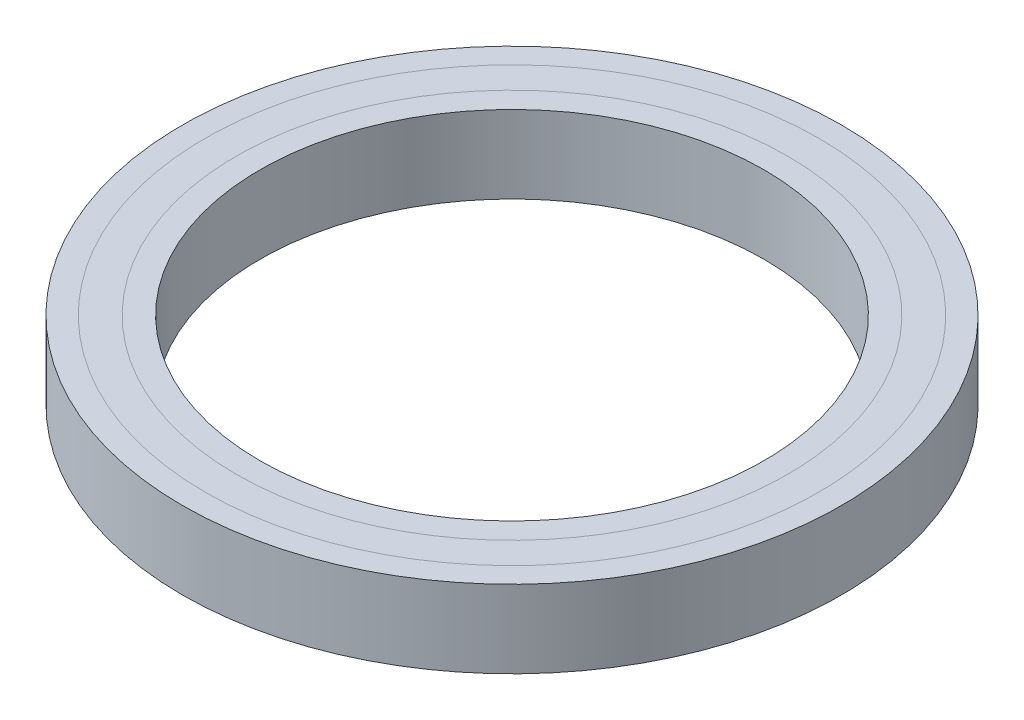
ISO-10303-21;
HEADER;
FILE_DESCRIPTION(('STEP AP214'),'2;1');
FILE_NAME('part.step','',(''),(''),'','','');
FILE_SCHEMA(('AUTOMOTIVE_DESIGN { 1 0 10303 214 1 1 1 1 }'));
ENDSEC;
DATA;
#1=APPLICATION_CONTEXT('core data for automotive mechanical design processes');
#2=APPLICATION_PROTOCOL_DEFINITION('international standard','automotive_design',2000,#1);
#3=PRODUCT_CONTEXT('',#1,'mechanical');
#4=PRODUCT('Part','Part','',(#3));
#5=PRODUCT_RELATED_PRODUCT_CATEGORY('part','',(#4));
#6=PRODUCT_DEFINITION_FORMATION('','',#4);
#7=PRODUCT_DEFINITION_CONTEXT('part definition',#1,'design');
#8=PRODUCT_DEFINITION('design','',#6,#7);
#9=PRODUCT_DEFINITION_SHAPE('','',#8);
#10=(LENGTH_UNIT() NAMED_UNIT(*) SI_UNIT(.MILLI.,.METRE.));
#11=(NAMED_UNIT(*) PLANE_ANGLE_UNIT() SI_UNIT($,.RADIAN.));
#12=(NAMED_UNIT(*) SI_UNIT($,.STERADIAN.) SOLID_ANGLE_UNIT());
#13=UNCERTAINTY_MEASURE_WITH_UNIT(LENGTH_MEASURE(1.E-05),#10,'distance_accuracy_value','');
#14=(GEOMETRIC_REPRESENTATION_CONTEXT(3) GLOBAL_UNCERTAINTY_ASSIGNED_CONTEXT((#13)) GLOBAL_UNIT_ASSIGNED_CONTEXT((#10,
#11,#12)) REPRESENTATION_CONTEXT('',''));
#15=CARTESIAN_POINT('',(0.,0.,0.));
#16=DIRECTION('',(0.,0.,1.));
#17=DIRECTION('',(1.,0.,0.));
#18=AXIS2_PLACEMENT_3D('',#15,#16,#17);
#19=CARTESIAN_POINT('',(0.,10.,0.));
#20=DIRECTION('',(0.,1.,0.));
#21=DIRECTION('',(0.,0.,1.));
#22=AXIS2_PLACEMENT_3D('',#19,#20,#21);
#23=PLANE('',#22);
#24=CARTESIAN_POINT('',(0.,10.,0.));
#25=DIRECTION('',(0.,1.,0.));
#26=DIRECTION('',(0.,0.,1.));
#27=AXIS2_PLACEMENT_3D('',#24,#25,#26);
#28=CIRCLE('',#27,42.5);
#29=CARTESIAN_POINT('',(0.,10.,42.5));
#30=VERTEX_POINT('',#29);
#31=EDGE_CURVE('E11',#30,#30,#28,.T.);
#32=ORIENTED_EDGE('',*,*,#31,.T.);
#33=EDGE_LOOP('',(#32));
#34=FACE_BOUND('',#33,.T.);
#35=CARTESIAN_POINT('',(0.,10.,0.));
#36=DIRECTION('',(0.,1.,0.));
#37=DIRECTION('',(0.,0.,1.));
#38=AXIS2_PLACEMENT_3D('',#35,#36,#37);
#39=CIRCLE('',#38,39.55);
#40=CARTESIAN_POINT('',(0.,10.,39.55));
#41=VERTEX_POINT('',#40);
#42=EDGE_CURVE('E51',#41,#41,#39,.T.);
#43=ORIENTED_EDGE('',*,*,#42,.F.);
#44=EDGE_LOOP('',(#43));
#45=FACE_BOUND('',#44,.T.);
#46=ADVANCED_FACE('F40',(#34,#45),#23,.T.);
#47=CARTESIAN_POINT('',(0.,0.,0.));
#48=DIRECTION('',(0.,1.,0.));
#49=DIRECTION('',(0.,0.,1.));
#50=AXIS2_PLACEMENT_3D('',#47,#48,#49);
#51=PLANE('',#50);
#52=CARTESIAN_POINT('',(0.,0.,0.));
#53=DIRECTION('',(0.,1.,0.));
#54=DIRECTION('',(0.,0.,1.));
#55=AXIS2_PLACEMENT_3D('',#52,#53,#54);
#56=CIRCLE('',#55,42.5);
#57=CARTESIAN_POINT('',(0.,0.,42.5));
#58=VERTEX_POINT('',#57);
#59=EDGE_CURVE('E44',#58,#58,#56,.T.);
#60=ORIENTED_EDGE('',*,*,#59,.F.);
#61=EDGE_LOOP('',(#60));
#62=FACE_BOUND('',#61,.T.);
#63=CARTESIAN_POINT('',(0.,0.,0.));
#64=DIRECTION('',(0.,1.,0.));
#65=DIRECTION('',(0.,0.,1.));
#66=AXIS2_PLACEMENT_3D('',#63,#64,#65);
#67=CIRCLE('',#66,39.55);
#68=CARTESIAN_POINT('',(0.,0.,39.55));
#69=VERTEX_POINT('',#68);
#70=EDGE_CURVE('E53',#69,#69,#67,.T.);
#71=ORIENTED_EDGE('',*,*,#70,.T.);
#72=EDGE_LOOP('',(#71));
#73=FACE_BOUND('',#72,.T.);
#74=ADVANCED_FACE('F63',(#62,#73),#51,.F.);
#75=CARTESIAN_POINT('',(0.,10.,0.));
#76=DIRECTION('',(0.,-1.,0.));
#77=DIRECTION('',(0.,0.,-1.));
#78=AXIS2_PLACEMENT_3D('',#75,#76,#77);
#79=CYLINDRICAL_SURFACE('',#78,42.5);
#80=ORIENTED_EDGE('',*,*,#31,.F.);
#81=EDGE_LOOP('',(#80));
#82=FACE_BOUND('',#81,.T.);
#83=ORIENTED_EDGE('',*,*,#59,.T.);
#84=EDGE_LOOP('',(#83));
#85=FACE_BOUND('',#84,.T.);
#86=ADVANCED_FACE('F42',(#82,#85),#79,.T.);
#87=CARTESIAN_POINT('',(0.,10.,0.));
#88=DIRECTION('',(0.,-1.,0.));
#89=DIRECTION('',(0.,0.,-1.));
#90=AXIS2_PLACEMENT_3D('',#87,#88,#89);
#91=CYLINDRICAL_SURFACE('',#90,39.55);
#92=ORIENTED_EDGE('',*,*,#42,.T.);
#93=EDGE_LOOP('',(#92));
#94=FACE_BOUND('',#93,.T.);
#95=ORIENTED_EDGE('',*,*,#70,.F.);
#96=EDGE_LOOP('',(#95));
#97=FACE_BOUND('',#96,.T.);
#98=ADVANCED_FACE('F59',(#94,#97),#91,.F.);
#99=CLOSED_SHELL('',(#46,#74,#86,#98));
#100=MANIFOLD_SOLID_BREP('B2',#99);
#101=CARTESIAN_POINT('',(0.,10.,0.));
#102=DIRECTION('',(0.,1.,0.));
#103=DIRECTION('',(0.,0.,1.));
#104=AXIS2_PLACEMENT_3D('',#101,#102,#103);
#105=PLANE('',#104);
#106=CARTESIAN_POINT('',(0.,10.,0.));
#107=DIRECTION('',(0.,1.,0.));
#108=DIRECTION('',(0.,0.,1.));
#109=AXIS2_PLACEMENT_3D('',#106,#107,#108);
#110=CIRCLE('',#109,39.55);
#111=CARTESIAN_POINT('',(0.,10.,39.55));
#112=VERTEX_POINT('',#111);
#113=EDGE_CURVE('E39',#112,#112,#110,.T.);
#114=ORIENTED_EDGE('',*,*,#113,.T.);
#115=EDGE_LOOP('',(#114));
#116=FACE_BOUND('',#115,.T.);
#117=CARTESIAN_POINT('',(0.,10.,0.));
#118=DIRECTION('',(0.,1.,0.));
#119=DIRECTION('',(0.,0.,1.));
#120=AXIS2_PLACEMENT_3D('',#117,#118,#119);
#121=CIRCLE('',#120,35.55);
#122=CARTESIAN_POINT('',(0.,10.,35.55));
#123=VERTEX_POINT('',#122);
#124=EDGE_CURVE('E120',#123,#123,#121,.T.);
#125=ORIENTED_EDGE('',*,*,#124,.F.);
#126=EDGE_LOOP('',(#125));
#127=FACE_BOUND('',#126,.T.);
#128=ADVANCED_FACE('F109',(#116,#127),#105,.T.);
#129=CARTESIAN_POINT('',(0.,0.,0.));
#130=DIRECTION('',(0.,1.,0.));
#131=DIRECTION('',(0.,0.,1.));
#132=AXIS2_PLACEMENT_3D('',#129,#130,#131);
#133=PLANE('',#132);
#134=CARTESIAN_POINT('',(0.,0.,0.));
#135=DIRECTION('',(0.,1.,0.));
#136=DIRECTION('',(0.,0.,1.));
#137=AXIS2_PLACEMENT_3D('',#134,#135,#136);
#138=CIRCLE('',#137,39.55);
#139=CARTESIAN_POINT('',(0.,0.,39.55));
#140=VERTEX_POINT('',#139);
#141=EDGE_CURVE('E113',#140,#140,#138,.T.);
#142=ORIENTED_EDGE('',*,*,#141,.F.);
#143=EDGE_LOOP('',(#142));
#144=FACE_BOUND('',#143,.T.);
#145=CARTESIAN_POINT('',(0.,0.,0.));
#146=DIRECTION('',(0.,1.,0.));
#147=DIRECTION('',(0.,0.,1.));
#148=AXIS2_PLACEMENT_3D('',#145,#146,#147);
#149=CIRCLE('',#148,35.55);
#150=CARTESIAN_POINT('',(0.,0.,35.55));
#151=VERTEX_POINT('',#150);
#152=EDGE_CURVE('E122',#151,#151,#149,.T.);
#153=ORIENTED_EDGE('',*,*,#152,.T.);
#154=EDGE_LOOP('',(#153));
#155=FACE_BOUND('',#154,.T.);
#156=ADVANCED_FACE('F132',(#144,#155),#133,.F.);
#157=CARTESIAN_POINT('',(0.,10.,0.));
#158=DIRECTION('',(0.,-1.,0.));
#159=DIRECTION('',(0.,0.,-1.));
#160=AXIS2_PLACEMENT_3D('',#157,#158,#159);
#161=CYLINDRICAL_SURFACE('',#160,39.55);
#162=ORIENTED_EDGE('',*,*,#113,.F.);
#163=EDGE_LOOP('',(#162));
#164=FACE_BOUND('',#163,.T.);
#165=ORIENTED_EDGE('',*,*,#141,.T.);
#166=EDGE_LOOP('',(#165));
#167=FACE_BOUND('',#166,.T.);
#168=ADVANCED_FACE('F111',(#164,#167),#161,.T.);
#169=CARTESIAN_POINT('',(0.,10.,0.));
#170=DIRECTION('',(0.,-1.,0.));
#171=DIRECTION('',(0.,0.,-1.));
#172=AXIS2_PLACEMENT_3D('',#169,#170,#171);
#173=CYLINDRICAL_SURFACE('',#172,35.55);
#174=ORIENTED_EDGE('',*,*,#124,.T.);
#175=EDGE_LOOP('',(#174));
#176=FACE_BOUND('',#175,.T.);
#177=ORIENTED_EDGE('',*,*,#152,.F.);
#178=EDGE_LOOP('',(#177));
#179=FACE_BOUND('',#178,.T.);
#180=ADVANCED_FACE('F128',(#176,#179),#173,.F.);
#181=CLOSED_SHELL('',(#128,#156,#168,#180));
#182=MANIFOLD_SOLID_BREP('B6',#181);
#183=CARTESIAN_POINT('',(0.,10.,0.));
#184=DIRECTION('',(0.,1.,0.));
#185=DIRECTION('',(0.,0.,1.));
#186=AXIS2_PLACEMENT_3D('',#183,#184,#185);
#187=PLANE('',#186);
#188=CARTESIAN_POINT('',(0.,10.,0.));
#189=DIRECTION('',(0.,1.,0.));
#190=DIRECTION('',(0.,0.,1.));
#191=AXIS2_PLACEMENT_3D('',#188,#189,#190);
#192=CIRCLE('',#191,35.55);
#193=CARTESIAN_POINT('',(0.,10.,35.55));
#194=VERTEX_POINT('',#193);
#195=EDGE_CURVE('E108',#194,#194,#192,.T.);
#196=ORIENTED_EDGE('',*,*,#195,.T.);
#197=EDGE_LOOP('',(#196));
#198=FACE_BOUND('',#197,.T.);
#199=CARTESIAN_POINT('',(0.,10.,0.));
#200=DIRECTION('',(0.,1.,0.));
#201=DIRECTION('',(0.,0.,1.));
#202=AXIS2_PLACEMENT_3D('',#199,#200,#201);
#203=CIRCLE('',#202,32.5);
#204=CARTESIAN_POINT('',(0.,10.,32.5));
#205=VERTEX_POINT('',#204);
#206=EDGE_CURVE('E182',#205,#205,#203,.T.);
#207=ORIENTED_EDGE('',*,*,#206,.F.);
#208=EDGE_LOOP('',(#207));
#209=FACE_BOUND('',#208,.T.);
#210=ADVANCED_FACE('F171',(#198,#209),#187,.T.);
#211=CARTESIAN_POINT('',(0.,0.,0.));
#212=DIRECTION('',(0.,1.,0.));
#213=DIRECTION('',(0.,0.,1.));
#214=AXIS2_PLACEMENT_3D('',#211,#212,#213);
#215=PLANE('',#214);
#216=CARTESIAN_POINT('',(0.,0.,0.));
#217=DIRECTION('',(0.,1.,0.));
#218=DIRECTION('',(0.,0.,1.));
#219=AXIS2_PLACEMENT_3D('',#216,#217,#218);
#220=CIRCLE('',#219,35.55);
#221=CARTESIAN_POINT('',(0.,0.,35.55));
#222=VERTEX_POINT('',#221);
#223=EDGE_CURVE('E175',#222,#222,#220,.T.);
#224=ORIENTED_EDGE('',*,*,#223,.F.);
#225=EDGE_LOOP('',(#224));
#226=FACE_BOUND('',#225,.T.);
#227=CARTESIAN_POINT('',(0.,0.,0.));
#228=DIRECTION('',(0.,1.,0.));
#229=DIRECTION('',(0.,0.,1.));
#230=AXIS2_PLACEMENT_3D('',#227,#228,#229);
#231=CIRCLE('',#230,32.5);
#232=CARTESIAN_POINT('',(0.,0.,32.5));
#233=VERTEX_POINT('',#232);
#234=EDGE_CURVE('E184',#233,#233,#231,.T.);
#235=ORIENTED_EDGE('',*,*,#234,.T.);
#236=EDGE_LOOP('',(#235));
#237=FACE_BOUND('',#236,.T.);
#238=ADVANCED_FACE('F194',(#226,#237),#215,.F.);
#239=CARTESIAN_POINT('',(0.,10.,0.));
#240=DIRECTION('',(0.,-1.,0.));
#241=DIRECTION('',(0.,0.,-1.));
#242=AXIS2_PLACEMENT_3D('',#239,#240,#241);
#243=CYLINDRICAL_SURFACE('',#242,35.55);
#244=ORIENTED_EDGE('',*,*,#195,.F.);
#245=EDGE_LOOP('',(#244));
#246=FACE_BOUND('',#245,.T.);
#247=ORIENTED_EDGE('',*,*,#223,.T.);
#248=EDGE_LOOP('',(#247));
#249=FACE_BOUND('',#248,.T.);
#250=ADVANCED_FACE('F173',(#246,#249),#243,.T.);
#251=CARTESIAN_POINT('',(0.,10.,0.));
#252=DIRECTION('',(0.,-1.,0.));
#253=DIRECTION('',(0.,0.,-1.));
#254=AXIS2_PLACEMENT_3D('',#251,#252,#253);
#255=CYLINDRICAL_SURFACE('',#254,32.5);
#256=ORIENTED_EDGE('',*,*,#206,.T.);
#257=EDGE_LOOP('',(#256));
#258=FACE_BOUND('',#257,.T.);
#259=ORIENTED_EDGE('',*,*,#234,.F.);
#260=EDGE_LOOP('',(#259));
#261=FACE_BOUND('',#260,.T.);
#262=ADVANCED_FACE('F190',(#258,#261),#255,.F.);
#263=CLOSED_SHELL('',(#210,#238,#250,#262));
#264=MANIFOLD_SOLID_BREP('B34',#263);
#265=ADVANCED_BREP_SHAPE_REPRESENTATION('',(#18,#100,#182,#264),#14);
#266=SHAPE_DEFINITION_REPRESENTATION(#9,#265);
ENDSEC;
END-ISO-10303-21;
